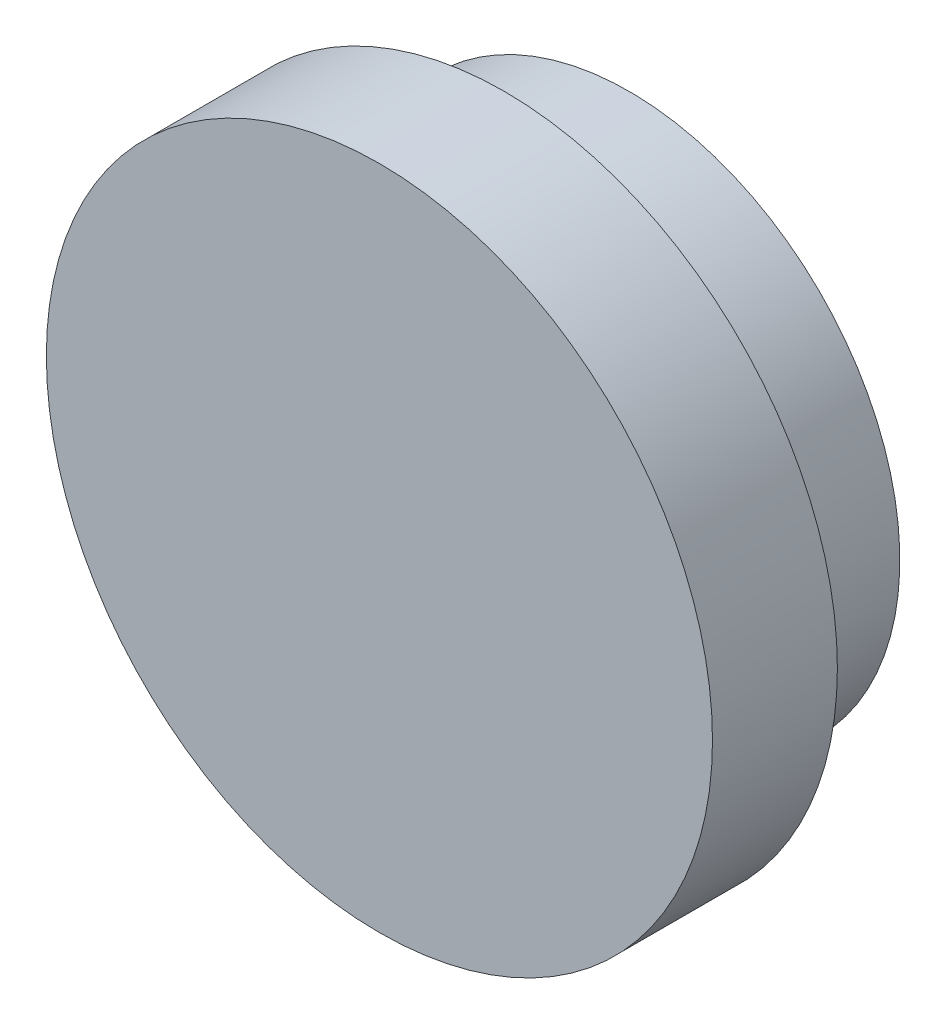
ISO-10303-21;
HEADER;
FILE_DESCRIPTION(('STEP AP214'),'2;1');
FILE_NAME('part.step','',(''),(''),'','','');
FILE_SCHEMA(('AUTOMOTIVE_DESIGN { 1 0 10303 214 1 1 1 1 }'));
ENDSEC;
DATA;
#1=APPLICATION_CONTEXT('core data for automotive mechanical design processes');
#2=APPLICATION_PROTOCOL_DEFINITION('international standard','automotive_design',2000,#1);
#3=PRODUCT_CONTEXT('',#1,'mechanical');
#4=PRODUCT('Part','Part','',(#3));
#5=PRODUCT_RELATED_PRODUCT_CATEGORY('part','',(#4));
#6=PRODUCT_DEFINITION_FORMATION('','',#4);
#7=PRODUCT_DEFINITION_CONTEXT('part definition',#1,'design');
#8=PRODUCT_DEFINITION('design','',#6,#7);
#9=PRODUCT_DEFINITION_SHAPE('','',#8);
#10=(LENGTH_UNIT() NAMED_UNIT(*) SI_UNIT(.MILLI.,.METRE.));
#11=(NAMED_UNIT(*) PLANE_ANGLE_UNIT() SI_UNIT($,.RADIAN.));
#12=(NAMED_UNIT(*) SI_UNIT($,.STERADIAN.) SOLID_ANGLE_UNIT());
#13=UNCERTAINTY_MEASURE_WITH_UNIT(LENGTH_MEASURE(1.E-05),#10,'distance_accuracy_value','');
#14=(GEOMETRIC_REPRESENTATION_CONTEXT(3) GLOBAL_UNCERTAINTY_ASSIGNED_CONTEXT((#13)) GLOBAL_UNIT_ASSIGNED_CONTEXT((#10,
#11,#12)) REPRESENTATION_CONTEXT('',''));
#15=CARTESIAN_POINT('',(0.,0.,0.));
#16=DIRECTION('',(0.,0.,1.));
#17=DIRECTION('',(1.,0.,0.));
#18=AXIS2_PLACEMENT_3D('',#15,#16,#17);
#19=CARTESIAN_POINT('',(0.,0.,0.));
#20=DIRECTION('',(0.,0.,1.));
#21=DIRECTION('',(1.,0.,0.));
#22=AXIS2_PLACEMENT_3D('',#19,#20,#21);
#23=PLANE('',#22);
#24=CARTESIAN_POINT('',(0.,0.,0.));
#25=DIRECTION('',(0.,0.,-1.));
#26=DIRECTION('',(-1.,0.,0.));
#27=AXIS2_PLACEMENT_3D('',#24,#25,#26);
#28=CIRCLE('',#27,8.);
#29=CARTESIAN_POINT('',(-8.,0.,0.));
#30=VERTEX_POINT('',#29);
#31=EDGE_CURVE('E10',#30,#30,#28,.T.);
#32=ORIENTED_EDGE('',*,*,#31,.F.);
#33=EDGE_LOOP('',(#32));
#34=FACE_BOUND('',#33,.T.);
#35=ADVANCED_FACE('F31',(#34),#23,.T.);
#36=CARTESIAN_POINT('',(0.,0.,-6.00000000000001));
#37=DIRECTION('',(0.,0.,-1.));
#38=DIRECTION('',(-1.,0.,0.));
#39=AXIS2_PLACEMENT_3D('',#36,#37,#38);
#40=CYLINDRICAL_SURFACE('',#39,8.);
#41=ORIENTED_EDGE('',*,*,#31,.T.);
#42=EDGE_LOOP('',(#41));
#43=FACE_BOUND('',#42,.T.);
#44=CARTESIAN_POINT('',(0.,0.,-3.));
#45=DIRECTION('',(0.,0.,-1.));
#46=DIRECTION('',(-1.,0.,0.));
#47=AXIS2_PLACEMENT_3D('',#44,#45,#46);
#48=CIRCLE('',#47,8.);
#49=CARTESIAN_POINT('',(-8.,0.,-3.));
#50=VERTEX_POINT('',#49);
#51=EDGE_CURVE('E37',#50,#50,#48,.T.);
#52=ORIENTED_EDGE('',*,*,#51,.F.);
#53=EDGE_LOOP('',(#52));
#54=FACE_BOUND('',#53,.T.);
#55=ADVANCED_FACE('F63',(#43,#54),#40,.T.);
#56=CARTESIAN_POINT('',(0.,8.,-3.));
#57=DIRECTION('',(0.,0.,-1.));
#58=DIRECTION('',(-1.,0.,0.));
#59=AXIS2_PLACEMENT_3D('',#56,#57,#58);
#60=PLANE('',#59);
#61=ORIENTED_EDGE('',*,*,#51,.T.);
#62=EDGE_LOOP('',(#61));
#63=FACE_BOUND('',#62,.T.);
#64=CARTESIAN_POINT('',(0.,0.,-3.));
#65=DIRECTION('',(0.,0.,-1.));
#66=DIRECTION('',(-1.,0.,0.));
#67=AXIS2_PLACEMENT_3D('',#64,#65,#66);
#68=CIRCLE('',#67,6.5);
#69=CARTESIAN_POINT('',(-6.5,0.,-3.));
#70=VERTEX_POINT('',#69);
#71=EDGE_CURVE('E41',#70,#70,#68,.T.);
#72=ORIENTED_EDGE('',*,*,#71,.F.);
#73=EDGE_LOOP('',(#72));
#74=FACE_BOUND('',#73,.T.);
#75=ADVANCED_FACE('F55',(#63,#74),#60,.T.);
#76=CARTESIAN_POINT('',(0.,0.,-6.00000000000001));
#77=DIRECTION('',(0.,0.,-1.));
#78=DIRECTION('',(-1.,0.,0.));
#79=AXIS2_PLACEMENT_3D('',#76,#77,#78);
#80=CYLINDRICAL_SURFACE('',#79,6.5);
#81=ORIENTED_EDGE('',*,*,#71,.T.);
#82=EDGE_LOOP('',(#81));
#83=FACE_BOUND('',#82,.T.);
#84=CARTESIAN_POINT('',(0.,0.,-6.));
#85=DIRECTION('',(0.,0.,-1.));
#86=DIRECTION('',(-1.,0.,0.));
#87=AXIS2_PLACEMENT_3D('',#84,#85,#86);
#88=CIRCLE('',#87,6.5);
#89=CARTESIAN_POINT('',(-6.5,0.,-6.));
#90=VERTEX_POINT('',#89);
#91=EDGE_CURVE('E45',#90,#90,#88,.T.);
#92=ORIENTED_EDGE('',*,*,#91,.F.);
#93=EDGE_LOOP('',(#92));
#94=FACE_BOUND('',#93,.T.);
#95=ADVANCED_FACE('F53',(#83,#94),#80,.T.);
#96=CARTESIAN_POINT('',(0.,6.5,-6.00000000000001));
#97=DIRECTION('',(0.,0.,-1.));
#98=DIRECTION('',(-1.,0.,0.));
#99=AXIS2_PLACEMENT_3D('',#96,#97,#98);
#100=PLANE('',#99);
#101=ORIENTED_EDGE('',*,*,#91,.T.);
#102=EDGE_LOOP('',(#101));
#103=FACE_BOUND('',#102,.T.);
#104=ADVANCED_FACE('F51',(#103),#100,.T.);
#105=CLOSED_SHELL('',(#35,#55,#75,#95,#104));
#106=MANIFOLD_SOLID_BREP('B2',#105);
#107=ADVANCED_BREP_SHAPE_REPRESENTATION('',(#18,#106),#14);
#108=SHAPE_DEFINITION_REPRESENTATION(#9,#107);
ENDSEC;
END-ISO-10303-21;
